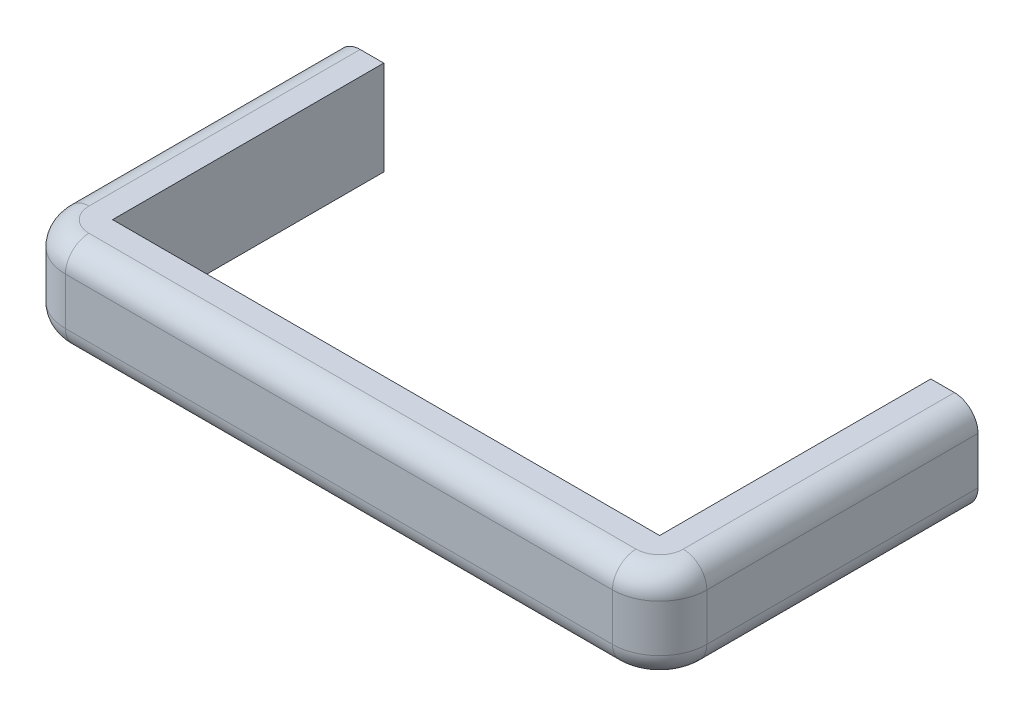
ISO-10303-21;
HEADER;
FILE_DESCRIPTION(('STEP AP214'),'2;1');
FILE_NAME('part.step','',(''),(''),'','','');
FILE_SCHEMA(('AUTOMOTIVE_DESIGN { 1 0 10303 214 1 1 1 1 }'));
ENDSEC;
DATA;
#1=APPLICATION_CONTEXT('core data for automotive mechanical design processes');
#2=APPLICATION_PROTOCOL_DEFINITION('international standard','automotive_design',2000,#1);
#3=PRODUCT_CONTEXT('',#1,'mechanical');
#4=PRODUCT('Part','Part','',(#3));
#5=PRODUCT_RELATED_PRODUCT_CATEGORY('part','',(#4));
#6=PRODUCT_DEFINITION_FORMATION('','',#4);
#7=PRODUCT_DEFINITION_CONTEXT('part definition',#1,'design');
#8=PRODUCT_DEFINITION('design','',#6,#7);
#9=PRODUCT_DEFINITION_SHAPE('','',#8);
#10=(LENGTH_UNIT() NAMED_UNIT(*) SI_UNIT(.MILLI.,.METRE.));
#11=(NAMED_UNIT(*) PLANE_ANGLE_UNIT() SI_UNIT($,.RADIAN.));
#12=(NAMED_UNIT(*) SI_UNIT($,.STERADIAN.) SOLID_ANGLE_UNIT());
#13=UNCERTAINTY_MEASURE_WITH_UNIT(LENGTH_MEASURE(1.E-05),#10,'distance_accuracy_value','');
#14=(GEOMETRIC_REPRESENTATION_CONTEXT(3) GLOBAL_UNCERTAINTY_ASSIGNED_CONTEXT((#13)) GLOBAL_UNIT_ASSIGNED_CONTEXT((#10,
#11,#12)) REPRESENTATION_CONTEXT('',''));
#15=CARTESIAN_POINT('',(0.,0.,0.));
#16=DIRECTION('',(0.,0.,1.));
#17=DIRECTION('',(1.,0.,0.));
#18=AXIS2_PLACEMENT_3D('',#15,#16,#17);
#19=CARTESIAN_POINT('',(736.6,0.,-768.35));
#20=DIRECTION('',(-1.,0.,0.));
#21=DIRECTION('',(0.,0.,1.));
#22=AXIS2_PLACEMENT_3D('',#19,#20,#21);
#23=PLANE('',#22);
#24=DIRECTION('',(0.,1.,0.));
#25=VECTOR('',#24,1.);
#26=CARTESIAN_POINT('',(736.6,0.,-396.875));
#27=LINE('',#26,#25);
#28=CARTESIAN_POINT('',(736.6,-95.25,-396.875));
#29=VERTEX_POINT('',#28);
#30=CARTESIAN_POINT('',(736.6,31.7499999999999,-396.875));
#31=VERTEX_POINT('',#30);
#32=EDGE_CURVE('E376',#29,#31,#27,.T.);
#33=ORIENTED_EDGE('',*,*,#32,.F.);
#34=DIRECTION('',(0.,0.,1.));
#35=VECTOR('',#34,1.);
#36=CARTESIAN_POINT('',(736.6,-95.25,-768.35));
#37=LINE('',#36,#35);
#38=CARTESIAN_POINT('',(736.6,-95.25,-31.75));
#39=VERTEX_POINT('',#38);
#40=EDGE_CURVE('E234',#29,#39,#37,.T.);
#41=ORIENTED_EDGE('',*,*,#40,.T.);
#42=DIRECTION('',(0.,-1.,0.));
#43=VECTOR('',#42,1.);
#44=CARTESIAN_POINT('',(736.6,0.,-31.75));
#45=LINE('',#44,#43);
#46=CARTESIAN_POINT('',(736.6,31.75,-31.75));
#47=VERTEX_POINT('',#46);
#48=EDGE_CURVE('E221',#47,#39,#45,.T.);
#49=ORIENTED_EDGE('',*,*,#48,.F.);
#50=DIRECTION('',(0.,0.,1.));
#51=VECTOR('',#50,1.);
#52=CARTESIAN_POINT('',(736.6,31.75,-768.35));
#53=LINE('',#52,#51);
#54=EDGE_CURVE('E231',#31,#47,#53,.T.);
#55=ORIENTED_EDGE('',*,*,#54,.F.);
#56=EDGE_LOOP('',(#33,#41,#49,#55));
#57=FACE_BOUND('',#56,.T.);
#58=ADVANCED_FACE('F49',(#57),#23,.T.);
#59=CARTESIAN_POINT('',(736.6,0.,-31.75));
#60=DIRECTION('',(0.,0.,-1.));
#61=DIRECTION('',(-1.,0.,0.));
#62=AXIS2_PLACEMENT_3D('',#59,#60,#61);
#63=PLANE('',#62);
#64=DIRECTION('',(0.,1.,0.));
#65=VECTOR('',#64,1.);
#66=CARTESIAN_POINT('',(0.,0.,-31.75));
#67=LINE('',#66,#65);
#68=CARTESIAN_POINT('',(0.,-95.25,-31.75));
#69=VERTEX_POINT('',#68);
#70=CARTESIAN_POINT('',(0.,31.75,-31.75));
#71=VERTEX_POINT('',#70);
#72=EDGE_CURVE('E187',#69,#71,#67,.T.);
#73=ORIENTED_EDGE('',*,*,#72,.T.);
#74=DIRECTION('',(-1.,0.,0.));
#75=VECTOR('',#74,1.);
#76=CARTESIAN_POINT('',(736.6,31.75,-31.75));
#77=LINE('',#76,#75);
#78=EDGE_CURVE('E303',#47,#71,#77,.T.);
#79=ORIENTED_EDGE('',*,*,#78,.F.);
#80=ORIENTED_EDGE('',*,*,#48,.T.);
#81=DIRECTION('',(-1.,0.,0.));
#82=VECTOR('',#81,1.);
#83=CARTESIAN_POINT('',(736.6,-95.25,-31.75));
#84=LINE('',#83,#82);
#85=EDGE_CURVE('E306',#39,#69,#84,.T.);
#86=ORIENTED_EDGE('',*,*,#85,.T.);
#87=EDGE_LOOP('',(#73,#79,#80,#86));
#88=FACE_BOUND('',#87,.T.);
#89=ADVANCED_FACE('F388',(#88),#63,.T.);
#90=CARTESIAN_POINT('',(736.6,0.,31.75));
#91=DIRECTION('',(0.,0.,-1.));
#92=DIRECTION('',(-1.,0.,0.));
#93=AXIS2_PLACEMENT_3D('',#90,#91,#92);
#94=PLANE('',#93);
#95=DIRECTION('',(0.,-1.,0.));
#96=VECTOR('',#95,1.);
#97=CARTESIAN_POINT('',(0.,0.,31.75));
#98=LINE('',#97,#96);
#99=CARTESIAN_POINT('',(0.,0.,31.75));
#100=VERTEX_POINT('',#99);
#101=CARTESIAN_POINT('',(0.,-63.5,31.75));
#102=VERTEX_POINT('',#101);
#103=EDGE_CURVE('E271',#100,#102,#98,.T.);
#104=ORIENTED_EDGE('',*,*,#103,.T.);
#105=DIRECTION('',(-1.,0.,0.));
#106=VECTOR('',#105,1.);
#107=CARTESIAN_POINT('',(736.6,-63.5,31.75));
#108=LINE('',#107,#106);
#109=CARTESIAN_POINT('',(736.6,-63.5,31.75));
#110=VERTEX_POINT('',#109);
#111=EDGE_CURVE('E58',#110,#102,#108,.T.);
#112=ORIENTED_EDGE('',*,*,#111,.F.);
#113=DIRECTION('',(0.,-1.,0.));
#114=VECTOR('',#113,1.);
#115=CARTESIAN_POINT('',(736.6,0.,31.75));
#116=LINE('',#115,#114);
#117=CARTESIAN_POINT('',(736.6,0.,31.75));
#118=VERTEX_POINT('',#117);
#119=EDGE_CURVE('E272',#118,#110,#116,.T.);
#120=ORIENTED_EDGE('',*,*,#119,.F.);
#121=DIRECTION('',(-1.,0.,0.));
#122=VECTOR('',#121,1.);
#123=CARTESIAN_POINT('',(736.6,0.,31.75));
#124=LINE('',#123,#122);
#125=EDGE_CURVE('E285',#118,#100,#124,.T.);
#126=ORIENTED_EDGE('',*,*,#125,.T.);
#127=EDGE_LOOP('',(#104,#112,#120,#126));
#128=FACE_BOUND('',#127,.T.);
#129=ADVANCED_FACE('F51',(#128),#94,.F.);
#130=CARTESIAN_POINT('',(736.6,-63.5,0.));
#131=DIRECTION('',(-1.,0.,0.));
#132=DIRECTION('',(0.,0.,1.));
#133=AXIS2_PLACEMENT_3D('',#130,#131,#132);
#134=CYLINDRICAL_SURFACE('',#133,31.75);
#135=CARTESIAN_POINT('',(0.,-63.5,0.));
#136=DIRECTION('',(1.,0.,0.));
#137=DIRECTION('',(0.,0.,-1.));
#138=AXIS2_PLACEMENT_3D('',#135,#136,#137);
#139=CIRCLE('',#138,31.75);
#140=CARTESIAN_POINT('',(0.,-95.25,0.));
#141=VERTEX_POINT('',#140);
#142=EDGE_CURVE('E289',#102,#141,#139,.T.);
#143=ORIENTED_EDGE('',*,*,#142,.T.);
#144=DIRECTION('',(-1.,0.,0.));
#145=VECTOR('',#144,1.);
#146=CARTESIAN_POINT('',(736.6,-95.25,0.));
#147=LINE('',#146,#145);
#148=CARTESIAN_POINT('',(736.6,-95.25,0.));
#149=VERTEX_POINT('',#148);
#150=EDGE_CURVE('E310',#149,#141,#147,.T.);
#151=ORIENTED_EDGE('',*,*,#150,.F.);
#152=CARTESIAN_POINT('',(736.6,-63.5,0.));
#153=DIRECTION('',(1.,0.,0.));
#154=DIRECTION('',(0.,0.,-1.));
#155=AXIS2_PLACEMENT_3D('',#152,#153,#154);
#156=CIRCLE('',#155,31.75);
#157=EDGE_CURVE('E276',#110,#149,#156,.T.);
#158=ORIENTED_EDGE('',*,*,#157,.F.);
#159=ORIENTED_EDGE('',*,*,#111,.T.);
#160=EDGE_LOOP('',(#143,#151,#158,#159));
#161=FACE_BOUND('',#160,.T.);
#162=ADVANCED_FACE('F317',(#161),#134,.T.);
#163=CARTESIAN_POINT('',(736.6,-95.25,0.));
#164=DIRECTION('',(0.,1.,0.));
#165=DIRECTION('',(0.,0.,1.));
#166=AXIS2_PLACEMENT_3D('',#163,#164,#165);
#167=PLANE('',#166);
#168=DIRECTION('',(0.,0.,1.));
#169=VECTOR('',#168,1.);
#170=CARTESIAN_POINT('',(-31.75,-95.25,-768.35));
#171=LINE('',#170,#169);
#172=CARTESIAN_POINT('',(-31.75,-95.25,-396.875));
#173=VERTEX_POINT('',#172);
#174=CARTESIAN_POINT('',(-31.75,-95.25,-31.7500000000001));
#175=VERTEX_POINT('',#174);
#176=EDGE_CURVE('E193',#173,#175,#171,.T.);
#177=ORIENTED_EDGE('',*,*,#176,.F.);
#178=DIRECTION('',(1.,0.,0.));
#179=VECTOR('',#178,1.);
#180=CARTESIAN_POINT('',(-63.5000000000001,-95.25,-396.875));
#181=LINE('',#180,#179);
#182=CARTESIAN_POINT('',(0.,-95.25,-396.875));
#183=VERTEX_POINT('',#182);
#184=EDGE_CURVE('E396',#173,#183,#181,.T.);
#185=ORIENTED_EDGE('',*,*,#184,.T.);
#186=DIRECTION('',(0.,0.,1.));
#187=VECTOR('',#186,1.);
#188=CARTESIAN_POINT('',(0.,-95.25,-768.35));
#189=LINE('',#188,#187);
#190=EDGE_CURVE('E196',#183,#69,#189,.T.);
#191=ORIENTED_EDGE('',*,*,#190,.T.);
#192=ORIENTED_EDGE('',*,*,#85,.F.);
#193=ORIENTED_EDGE('',*,*,#40,.F.);
#194=CARTESIAN_POINT('',(768.35,-95.25,-396.875));
#195=VERTEX_POINT('',#194);
#196=EDGE_CURVE('E174',#29,#195,#181,.T.);
#197=ORIENTED_EDGE('',*,*,#196,.T.);
#198=DIRECTION('',(0.,0.,1.));
#199=VECTOR('',#198,1.);
#200=CARTESIAN_POINT('',(768.35,-95.25,-768.35));
#201=LINE('',#200,#199);
#202=CARTESIAN_POINT('',(768.35,-95.25,-31.75));
#203=VERTEX_POINT('',#202);
#204=EDGE_CURVE('E237',#195,#203,#201,.T.);
#205=ORIENTED_EDGE('',*,*,#204,.T.);
#206=CARTESIAN_POINT('',(736.6,-95.25,-31.75));
#207=DIRECTION('',(0.,-1.,0.));
#208=DIRECTION('',(0.,0.,-1.));
#209=AXIS2_PLACEMENT_3D('',#206,#207,#208);
#210=CIRCLE('',#209,31.7500000000002);
#211=EDGE_CURVE('E259',#203,#149,#210,.T.);
#212=ORIENTED_EDGE('',*,*,#211,.T.);
#213=ORIENTED_EDGE('',*,*,#150,.T.);
#214=CARTESIAN_POINT('',(0.,-95.25,-31.75));
#215=DIRECTION('',(0.,1.,0.));
#216=DIRECTION('',(0.,0.,1.));
#217=AXIS2_PLACEMENT_3D('',#214,#215,#216);
#218=CIRCLE('',#217,31.75);
#219=EDGE_CURVE('E209',#175,#141,#218,.T.);
#220=ORIENTED_EDGE('',*,*,#219,.F.);
#221=EDGE_LOOP('',(#177,#185,#191,#192,#193,#197,#205,#212,#213,#220));
#222=FACE_BOUND('',#221,.T.);
#223=ADVANCED_FACE('F345',(#222),#167,.F.);
#224=CARTESIAN_POINT('',(736.6,31.75,0.));
#225=DIRECTION('',(0.,1.,0.));
#226=DIRECTION('',(0.,0.,1.));
#227=AXIS2_PLACEMENT_3D('',#224,#225,#226);
#228=PLANE('',#227);
#229=DIRECTION('',(1.,0.,0.));
#230=VECTOR('',#229,1.);
#231=CARTESIAN_POINT('',(-63.5000000000001,31.7499999999999,-396.875));
#232=LINE('',#231,#230);
#233=CARTESIAN_POINT('',(-31.75,31.7499999999999,-396.875));
#234=VERTEX_POINT('',#233);
#235=CARTESIAN_POINT('',(0.,31.7499999999999,-396.875));
#236=VERTEX_POINT('',#235);
#237=EDGE_CURVE('E161',#234,#236,#232,.T.);
#238=ORIENTED_EDGE('',*,*,#237,.F.);
#239=DIRECTION('',(0.,0.,1.));
#240=VECTOR('',#239,1.);
#241=CARTESIAN_POINT('',(-31.75,31.75,-768.35));
#242=LINE('',#241,#240);
#243=CARTESIAN_POINT('',(-31.75,31.75,-31.75));
#244=VERTEX_POINT('',#243);
#245=EDGE_CURVE('E169',#234,#244,#242,.T.);
#246=ORIENTED_EDGE('',*,*,#245,.T.);
#247=CARTESIAN_POINT('',(0.,31.75,-31.75));
#248=DIRECTION('',(0.,1.,0.));
#249=DIRECTION('',(0.,0.,1.));
#250=AXIS2_PLACEMENT_3D('',#247,#248,#249);
#251=CIRCLE('',#250,31.75);
#252=CARTESIAN_POINT('',(0.,31.75,0.));
#253=VERTEX_POINT('',#252);
#254=EDGE_CURVE('E212',#244,#253,#251,.T.);
#255=ORIENTED_EDGE('',*,*,#254,.T.);
#256=DIRECTION('',(-1.,0.,0.));
#257=VECTOR('',#256,1.);
#258=CARTESIAN_POINT('',(736.6,31.75,0.));
#259=LINE('',#258,#257);
#260=CARTESIAN_POINT('',(736.6,31.75,0.));
#261=VERTEX_POINT('',#260);
#262=EDGE_CURVE('E299',#261,#253,#259,.T.);
#263=ORIENTED_EDGE('',*,*,#262,.F.);
#264=CARTESIAN_POINT('',(736.6,31.75,-31.75));
#265=DIRECTION('',(0.,-1.,0.));
#266=DIRECTION('',(0.,0.,-1.));
#267=AXIS2_PLACEMENT_3D('',#264,#265,#266);
#268=CIRCLE('',#267,31.7500000000002);
#269=CARTESIAN_POINT('',(768.35,31.75,-31.75));
#270=VERTEX_POINT('',#269);
#271=EDGE_CURVE('E255',#270,#261,#268,.T.);
#272=ORIENTED_EDGE('',*,*,#271,.F.);
#273=DIRECTION('',(0.,0.,1.));
#274=VECTOR('',#273,1.);
#275=CARTESIAN_POINT('',(768.35,31.75,-768.35));
#276=LINE('',#275,#274);
#277=CARTESIAN_POINT('',(768.35,31.75,-396.875));
#278=VERTEX_POINT('',#277);
#279=EDGE_CURVE('E228',#278,#270,#276,.T.);
#280=ORIENTED_EDGE('',*,*,#279,.F.);
#281=EDGE_CURVE('E65',#31,#278,#232,.T.);
#282=ORIENTED_EDGE('',*,*,#281,.F.);
#283=ORIENTED_EDGE('',*,*,#54,.T.);
#284=ORIENTED_EDGE('',*,*,#78,.T.);
#285=DIRECTION('',(0.,0.,1.));
#286=VECTOR('',#285,1.);
#287=CARTESIAN_POINT('',(0.,31.75,-768.35));
#288=LINE('',#287,#286);
#289=EDGE_CURVE('E172',#236,#71,#288,.T.);
#290=ORIENTED_EDGE('',*,*,#289,.F.);
#291=EDGE_LOOP('',(#238,#246,#255,#263,#272,#280,#282,#283,#284,#290));
#292=FACE_BOUND('',#291,.T.);
#293=ADVANCED_FACE('F168',(#292),#228,.T.);
#294=CARTESIAN_POINT('',(736.6,0.,0.));
#295=DIRECTION('',(-1.,0.,0.));
#296=DIRECTION('',(0.,0.,1.));
#297=AXIS2_PLACEMENT_3D('',#294,#295,#296);
#298=CYLINDRICAL_SURFACE('',#297,31.75);
#299=CARTESIAN_POINT('',(0.,0.,0.));
#300=DIRECTION('',(1.,0.,0.));
#301=DIRECTION('',(0.,0.,-1.));
#302=AXIS2_PLACEMENT_3D('',#299,#300,#301);
#303=CIRCLE('',#302,31.75);
#304=EDGE_CURVE('E277',#253,#100,#303,.T.);
#305=ORIENTED_EDGE('',*,*,#304,.T.);
#306=ORIENTED_EDGE('',*,*,#125,.F.);
#307=CARTESIAN_POINT('',(736.6,0.,0.));
#308=DIRECTION('',(1.,0.,0.));
#309=DIRECTION('',(0.,0.,-1.));
#310=AXIS2_PLACEMENT_3D('',#307,#308,#309);
#311=CIRCLE('',#310,31.75);
#312=EDGE_CURVE('E281',#261,#118,#311,.T.);
#313=ORIENTED_EDGE('',*,*,#312,.F.);
#314=ORIENTED_EDGE('',*,*,#262,.T.);
#315=EDGE_LOOP('',(#305,#306,#313,#314));
#316=FACE_BOUND('',#315,.T.);
#317=ADVANCED_FACE('F329',(#316),#298,.T.);
#318=CARTESIAN_POINT('',(736.6,0.,-31.75));
#319=DIRECTION('',(0.,-1.,0.));
#320=DIRECTION('',(0.,0.,-1.));
#321=AXIS2_PLACEMENT_3D('',#318,#319,#320);
#322=TOROIDAL_SURFACE('',#321,31.7500000000002,31.75);
#323=CARTESIAN_POINT('',(736.6,0.,-31.75));
#324=DIRECTION('',(0.,-1.,0.));
#325=DIRECTION('',(0.,0.,-1.));
#326=AXIS2_PLACEMENT_3D('',#323,#324,#325);
#327=CIRCLE('',#326,63.5000000000001);
#328=CARTESIAN_POINT('',(800.1,0.,-31.75));
#329=VERTEX_POINT('',#328);
#330=EDGE_CURVE('E267',#329,#118,#327,.T.);
#331=ORIENTED_EDGE('',*,*,#330,.F.);
#332=CARTESIAN_POINT('',(768.35,0.,-31.7500000000001));
#333=DIRECTION('',(0.,0.,-1.));
#334=DIRECTION('',(-1.,0.,0.));
#335=AXIS2_PLACEMENT_3D('',#332,#333,#334);
#336=CIRCLE('',#335,31.75);
#337=EDGE_CURVE('E243',#270,#329,#336,.T.);
#338=ORIENTED_EDGE('',*,*,#337,.F.);
#339=ORIENTED_EDGE('',*,*,#271,.T.);
#340=ORIENTED_EDGE('',*,*,#312,.T.);
#341=EDGE_LOOP('',(#331,#338,#339,#340));
#342=FACE_BOUND('',#341,.T.);
#343=ADVANCED_FACE('F360',(#342),#322,.T.);
#344=CARTESIAN_POINT('',(736.6,-95.25,-31.75));
#345=DIRECTION('',(0.,-1.,0.));
#346=DIRECTION('',(0.,0.,-1.));
#347=AXIS2_PLACEMENT_3D('',#344,#345,#346);
#348=CYLINDRICAL_SURFACE('',#347,63.5000000000001);
#349=CARTESIAN_POINT('',(736.6,-63.5,-31.75));
#350=DIRECTION('',(0.,-1.,0.));
#351=DIRECTION('',(0.,0.,-1.));
#352=AXIS2_PLACEMENT_3D('',#349,#350,#351);
#353=CIRCLE('',#352,63.5000000000001);
#354=CARTESIAN_POINT('',(800.1,-63.5,-31.75));
#355=VERTEX_POINT('',#354);
#356=EDGE_CURVE('E263',#355,#110,#353,.T.);
#357=ORIENTED_EDGE('',*,*,#356,.F.);
#358=DIRECTION('',(0.,-1.,0.));
#359=VECTOR('',#358,1.);
#360=CARTESIAN_POINT('',(800.1,0.,-31.7500000000002));
#361=LINE('',#360,#359);
#362=EDGE_CURVE('E247',#329,#355,#361,.T.);
#363=ORIENTED_EDGE('',*,*,#362,.F.);
#364=ORIENTED_EDGE('',*,*,#330,.T.);
#365=ORIENTED_EDGE('',*,*,#119,.T.);
#366=EDGE_LOOP('',(#357,#363,#364,#365));
#367=FACE_BOUND('',#366,.T.);
#368=ADVANCED_FACE('F356',(#367),#348,.T.);
#369=CARTESIAN_POINT('',(736.6,-63.5,-31.75));
#370=DIRECTION('',(0.,-1.,0.));
#371=DIRECTION('',(0.,0.,-1.));
#372=AXIS2_PLACEMENT_3D('',#369,#370,#371);
#373=TOROIDAL_SURFACE('',#372,31.7500000000002,31.75);
#374=ORIENTED_EDGE('',*,*,#211,.F.);
#375=CARTESIAN_POINT('',(768.35,-63.5,-31.7500000000001));
#376=DIRECTION('',(0.,0.,-1.));
#377=DIRECTION('',(-1.,0.,0.));
#378=AXIS2_PLACEMENT_3D('',#375,#376,#377);
#379=CIRCLE('',#378,31.75);
#380=EDGE_CURVE('E251',#355,#203,#379,.T.);
#381=ORIENTED_EDGE('',*,*,#380,.F.);
#382=ORIENTED_EDGE('',*,*,#356,.T.);
#383=ORIENTED_EDGE('',*,*,#157,.T.);
#384=EDGE_LOOP('',(#374,#381,#382,#383));
#385=FACE_BOUND('',#384,.T.);
#386=ADVANCED_FACE('F352',(#385),#373,.T.);
#387=CARTESIAN_POINT('',(800.1,0.,-768.35));
#388=DIRECTION('',(-1.,0.,0.));
#389=DIRECTION('',(0.,0.,1.));
#390=AXIS2_PLACEMENT_3D('',#387,#388,#389);
#391=PLANE('',#390);
#392=DIRECTION('',(0.,0.,1.));
#393=VECTOR('',#392,1.);
#394=CARTESIAN_POINT('',(800.1,-63.5,-768.35));
#395=LINE('',#394,#393);
#396=CARTESIAN_POINT('',(800.1,-63.5,-396.875));
#397=VERTEX_POINT('',#396);
#398=EDGE_CURVE('E240',#397,#355,#395,.T.);
#399=ORIENTED_EDGE('',*,*,#398,.F.);
#400=DIRECTION('',(0.,-1.,0.));
#401=VECTOR('',#400,1.);
#402=CARTESIAN_POINT('',(800.1,31.7499999999999,-396.875));
#403=LINE('',#402,#401);
#404=CARTESIAN_POINT('',(800.1,0.,-396.875));
#405=VERTEX_POINT('',#404);
#406=EDGE_CURVE('E404',#405,#397,#403,.T.);
#407=ORIENTED_EDGE('',*,*,#406,.F.);
#408=DIRECTION('',(0.,0.,1.));
#409=VECTOR('',#408,1.);
#410=CARTESIAN_POINT('',(800.1,0.,-768.35));
#411=LINE('',#410,#409);
#412=EDGE_CURVE('E225',#405,#329,#411,.T.);
#413=ORIENTED_EDGE('',*,*,#412,.T.);
#414=ORIENTED_EDGE('',*,*,#362,.T.);
#415=EDGE_LOOP('',(#399,#407,#413,#414));
#416=FACE_BOUND('',#415,.T.);
#417=ADVANCED_FACE('F413',(#416),#391,.F.);
#418=CARTESIAN_POINT('',(768.35,-63.5,-768.35));
#419=DIRECTION('',(0.,0.,1.));
#420=DIRECTION('',(1.,0.,0.));
#421=AXIS2_PLACEMENT_3D('',#418,#419,#420);
#422=CYLINDRICAL_SURFACE('',#421,31.75);
#423=ORIENTED_EDGE('',*,*,#204,.F.);
#424=CARTESIAN_POINT('',(768.35,-63.5,-396.875));
#425=DIRECTION('',(0.,0.,1.));
#426=DIRECTION('',(1.,0.,0.));
#427=AXIS2_PLACEMENT_3D('',#424,#425,#426);
#428=CIRCLE('',#427,31.75);
#429=EDGE_CURVE('E370',#195,#397,#428,.T.);
#430=ORIENTED_EDGE('',*,*,#429,.T.);
#431=ORIENTED_EDGE('',*,*,#398,.T.);
#432=ORIENTED_EDGE('',*,*,#380,.T.);
#433=EDGE_LOOP('',(#423,#430,#431,#432));
#434=FACE_BOUND('',#433,.T.);
#435=ADVANCED_FACE('F412',(#434),#422,.T.);
#436=CARTESIAN_POINT('',(768.35,0.,-768.35));
#437=DIRECTION('',(0.,0.,1.));
#438=DIRECTION('',(1.,0.,0.));
#439=AXIS2_PLACEMENT_3D('',#436,#437,#438);
#440=CYLINDRICAL_SURFACE('',#439,31.75);
#441=ORIENTED_EDGE('',*,*,#412,.F.);
#442=CARTESIAN_POINT('',(768.35,0.,-396.875));
#443=DIRECTION('',(0.,0.,1.));
#444=DIRECTION('',(1.,0.,0.));
#445=AXIS2_PLACEMENT_3D('',#442,#443,#444);
#446=CIRCLE('',#445,31.75);
#447=EDGE_CURVE('E367',#405,#278,#446,.T.);
#448=ORIENTED_EDGE('',*,*,#447,.T.);
#449=ORIENTED_EDGE('',*,*,#279,.T.);
#450=ORIENTED_EDGE('',*,*,#337,.T.);
#451=EDGE_LOOP('',(#441,#448,#449,#450));
#452=FACE_BOUND('',#451,.T.);
#453=ADVANCED_FACE('F366',(#452),#440,.T.);
#454=CARTESIAN_POINT('',(0.,-63.5,-31.75));
#455=DIRECTION('',(0.,1.,0.));
#456=DIRECTION('',(0.,0.,1.));
#457=AXIS2_PLACEMENT_3D('',#454,#455,#456);
#458=DEGENERATE_TOROIDAL_SURFACE('',#457,31.75,31.75,.T.);
#459=CARTESIAN_POINT('',(0.,-63.5,-31.75));
#460=DIRECTION('',(0.,1.,0.));
#461=DIRECTION('',(0.,0.,1.));
#462=AXIS2_PLACEMENT_3D('',#459,#460,#461);
#463=CIRCLE('',#462,63.5);
#464=CARTESIAN_POINT('',(-63.5,-63.5,-31.7500000000002));
#465=VERTEX_POINT('',#464);
#466=EDGE_CURVE('E218',#465,#102,#463,.T.);
#467=ORIENTED_EDGE('',*,*,#466,.F.);
#468=CARTESIAN_POINT('',(-31.75,-63.5,-31.7500000000001));
#469=DIRECTION('',(0.,0.,-1.));
#470=DIRECTION('',(-1.,0.,0.));
#471=AXIS2_PLACEMENT_3D('',#468,#469,#470);
#472=CIRCLE('',#471,31.75);
#473=EDGE_CURVE('E199',#175,#465,#472,.T.);
#474=ORIENTED_EDGE('',*,*,#473,.F.);
#475=ORIENTED_EDGE('',*,*,#219,.T.);
#476=ORIENTED_EDGE('',*,*,#142,.F.);
#477=EDGE_LOOP('',(#467,#474,#475,#476));
#478=FACE_BOUND('',#477,.T.);
#479=ADVANCED_FACE('F343',(#478),#458,.T.);
#480=CARTESIAN_POINT('',(0.,31.75,-31.75));
#481=DIRECTION('',(0.,1.,0.));
#482=DIRECTION('',(0.,0.,1.));
#483=AXIS2_PLACEMENT_3D('',#480,#481,#482);
#484=CYLINDRICAL_SURFACE('',#483,63.5);
#485=CARTESIAN_POINT('',(0.,0.,-31.75));
#486=DIRECTION('',(0.,1.,0.));
#487=DIRECTION('',(0.,0.,1.));
#488=AXIS2_PLACEMENT_3D('',#485,#486,#487);
#489=CIRCLE('',#488,63.5);
#490=CARTESIAN_POINT('',(-63.5,0.,-31.7500000000002));
#491=VERTEX_POINT('',#490);
#492=EDGE_CURVE('E215',#491,#100,#489,.T.);
#493=ORIENTED_EDGE('',*,*,#492,.F.);
#494=DIRECTION('',(0.,1.,0.));
#495=VECTOR('',#494,1.);
#496=CARTESIAN_POINT('',(-63.5,0.,-31.7500000000002));
#497=LINE('',#496,#495);
#498=EDGE_CURVE('E203',#465,#491,#497,.T.);
#499=ORIENTED_EDGE('',*,*,#498,.F.);
#500=ORIENTED_EDGE('',*,*,#466,.T.);
#501=ORIENTED_EDGE('',*,*,#103,.F.);
#502=EDGE_LOOP('',(#493,#499,#500,#501));
#503=FACE_BOUND('',#502,.T.);
#504=ADVANCED_FACE('F324',(#503),#484,.T.);
#505=CARTESIAN_POINT('',(0.,0.,-31.75));
#506=DIRECTION('',(0.,1.,0.));
#507=DIRECTION('',(0.,0.,1.));
#508=AXIS2_PLACEMENT_3D('',#505,#506,#507);
#509=DEGENERATE_TOROIDAL_SURFACE('',#508,31.75,31.75,.T.);
#510=ORIENTED_EDGE('',*,*,#254,.F.);
#511=CARTESIAN_POINT('',(-31.75,0.,-31.7500000000001));
#512=DIRECTION('',(0.,0.,-1.));
#513=DIRECTION('',(-1.,0.,0.));
#514=AXIS2_PLACEMENT_3D('',#511,#512,#513);
#515=CIRCLE('',#514,31.75);
#516=EDGE_CURVE('E179',#491,#244,#515,.T.);
#517=ORIENTED_EDGE('',*,*,#516,.F.);
#518=ORIENTED_EDGE('',*,*,#492,.T.);
#519=ORIENTED_EDGE('',*,*,#304,.F.);
#520=EDGE_LOOP('',(#510,#517,#518,#519));
#521=FACE_BOUND('',#520,.T.);
#522=ADVANCED_FACE('F332',(#521),#509,.T.);
#523=CARTESIAN_POINT('',(0.,0.,-768.35));
#524=DIRECTION('',(1.,0.,0.));
#525=DIRECTION('',(0.,0.,-1.));
#526=AXIS2_PLACEMENT_3D('',#523,#524,#525);
#527=PLANE('',#526);
#528=DIRECTION('',(0.,-1.,0.));
#529=VECTOR('',#528,1.);
#530=CARTESIAN_POINT('',(0.,0.,-396.875));
#531=LINE('',#530,#529);
#532=EDGE_CURVE('E371',#236,#183,#531,.T.);
#533=ORIENTED_EDGE('',*,*,#532,.F.);
#534=ORIENTED_EDGE('',*,*,#289,.T.);
#535=ORIENTED_EDGE('',*,*,#72,.F.);
#536=ORIENTED_EDGE('',*,*,#190,.F.);
#537=EDGE_LOOP('',(#533,#534,#535,#536));
#538=FACE_BOUND('',#537,.T.);
#539=ADVANCED_FACE('F397',(#538),#527,.T.);
#540=CARTESIAN_POINT('',(-31.75,-63.5,-768.35));
#541=DIRECTION('',(0.,0.,1.));
#542=DIRECTION('',(1.,0.,0.));
#543=AXIS2_PLACEMENT_3D('',#540,#541,#542);
#544=CYLINDRICAL_SURFACE('',#543,31.75);
#545=DIRECTION('',(0.,0.,1.));
#546=VECTOR('',#545,1.);
#547=CARTESIAN_POINT('',(-63.5,-63.5,-768.35));
#548=LINE('',#547,#546);
#549=CARTESIAN_POINT('',(-63.5000000000001,-63.5,-396.875));
#550=VERTEX_POINT('',#549);
#551=EDGE_CURVE('E185',#550,#465,#548,.T.);
#552=ORIENTED_EDGE('',*,*,#551,.F.);
#553=CARTESIAN_POINT('',(-31.75,-63.5,-396.875));
#554=DIRECTION('',(0.,0.,1.));
#555=DIRECTION('',(1.,0.,0.));
#556=AXIS2_PLACEMENT_3D('',#553,#554,#555);
#557=CIRCLE('',#556,31.75);
#558=EDGE_CURVE('E378',#550,#173,#557,.T.);
#559=ORIENTED_EDGE('',*,*,#558,.T.);
#560=ORIENTED_EDGE('',*,*,#176,.T.);
#561=ORIENTED_EDGE('',*,*,#473,.T.);
#562=EDGE_LOOP('',(#552,#559,#560,#561));
#563=FACE_BOUND('',#562,.T.);
#564=ADVANCED_FACE('F338',(#563),#544,.T.);
#565=CARTESIAN_POINT('',(-63.5,0.,-768.35));
#566=DIRECTION('',(-1.,0.,0.));
#567=DIRECTION('',(0.,0.,1.));
#568=AXIS2_PLACEMENT_3D('',#565,#566,#567);
#569=PLANE('',#568);
#570=DIRECTION('',(0.,-1.,0.));
#571=VECTOR('',#570,1.);
#572=CARTESIAN_POINT('',(-63.5000000000001,31.7499999999999,-396.875));
#573=LINE('',#572,#571);
#574=CARTESIAN_POINT('',(-63.5,0.,-396.875));
#575=VERTEX_POINT('',#574);
#576=EDGE_CURVE('E73',#575,#550,#573,.T.);
#577=ORIENTED_EDGE('',*,*,#576,.T.);
#578=ORIENTED_EDGE('',*,*,#551,.T.);
#579=ORIENTED_EDGE('',*,*,#498,.T.);
#580=DIRECTION('',(0.,0.,1.));
#581=VECTOR('',#580,1.);
#582=CARTESIAN_POINT('',(-63.5,0.,-768.35));
#583=LINE('',#582,#581);
#584=EDGE_CURVE('E181',#575,#491,#583,.T.);
#585=ORIENTED_EDGE('',*,*,#584,.F.);
#586=EDGE_LOOP('',(#577,#578,#579,#585));
#587=FACE_BOUND('',#586,.T.);
#588=ADVANCED_FACE('F334',(#587),#569,.T.);
#589=CARTESIAN_POINT('',(-31.75,0.,-768.35));
#590=DIRECTION('',(0.,0.,1.));
#591=DIRECTION('',(1.,0.,0.));
#592=AXIS2_PLACEMENT_3D('',#589,#590,#591);
#593=CYLINDRICAL_SURFACE('',#592,31.75);
#594=ORIENTED_EDGE('',*,*,#245,.F.);
#595=CARTESIAN_POINT('',(-31.75,0.,-396.875));
#596=DIRECTION('',(0.,0.,1.));
#597=DIRECTION('',(1.,0.,0.));
#598=AXIS2_PLACEMENT_3D('',#595,#596,#597);
#599=CIRCLE('',#598,31.75);
#600=EDGE_CURVE('E11',#234,#575,#599,.T.);
#601=ORIENTED_EDGE('',*,*,#600,.T.);
#602=ORIENTED_EDGE('',*,*,#584,.T.);
#603=ORIENTED_EDGE('',*,*,#516,.T.);
#604=EDGE_LOOP('',(#594,#601,#602,#603));
#605=FACE_BOUND('',#604,.T.);
#606=ADVANCED_FACE('F177',(#605),#593,.T.);
#607=CARTESIAN_POINT('',(-63.5000000000001,31.7499999999999,-396.875));
#608=DIRECTION('',(0.,0.,1.));
#609=DIRECTION('',(1.,0.,0.));
#610=AXIS2_PLACEMENT_3D('',#607,#608,#609);
#611=PLANE('',#610);
#612=ORIENTED_EDGE('',*,*,#532,.T.);
#613=ORIENTED_EDGE('',*,*,#184,.F.);
#614=ORIENTED_EDGE('',*,*,#558,.F.);
#615=ORIENTED_EDGE('',*,*,#576,.F.);
#616=ORIENTED_EDGE('',*,*,#600,.F.);
#617=ORIENTED_EDGE('',*,*,#237,.T.);
#618=EDGE_LOOP('',(#612,#613,#614,#615,#616,#617));
#619=FACE_BOUND('',#618,.T.);
#620=ADVANCED_FACE('F160',(#619),#611,.F.);
#621=ORIENTED_EDGE('',*,*,#32,.T.);
#622=ORIENTED_EDGE('',*,*,#281,.T.);
#623=ORIENTED_EDGE('',*,*,#447,.F.);
#624=ORIENTED_EDGE('',*,*,#406,.T.);
#625=ORIENTED_EDGE('',*,*,#429,.F.);
#626=ORIENTED_EDGE('',*,*,#196,.F.);
#627=EDGE_LOOP('',(#621,#622,#623,#624,#625,#626));
#628=FACE_BOUND('',#627,.T.);
#629=ADVANCED_FACE('F408',(#628),#611,.F.);
#630=CLOSED_SHELL('',(#58,#89,#129,#162,#223,#293,#317,#343,#368,#386,#417,#435,#453,#479,#504,
#522,#539,#564,#588,#606,#620,#629));
#631=MANIFOLD_SOLID_BREP('B2',#630);
#632=ADVANCED_BREP_SHAPE_REPRESENTATION('',(#18,#631),#14);
#633=SHAPE_DEFINITION_REPRESENTATION(#9,#632);
ENDSEC;
END-ISO-10303-21;
